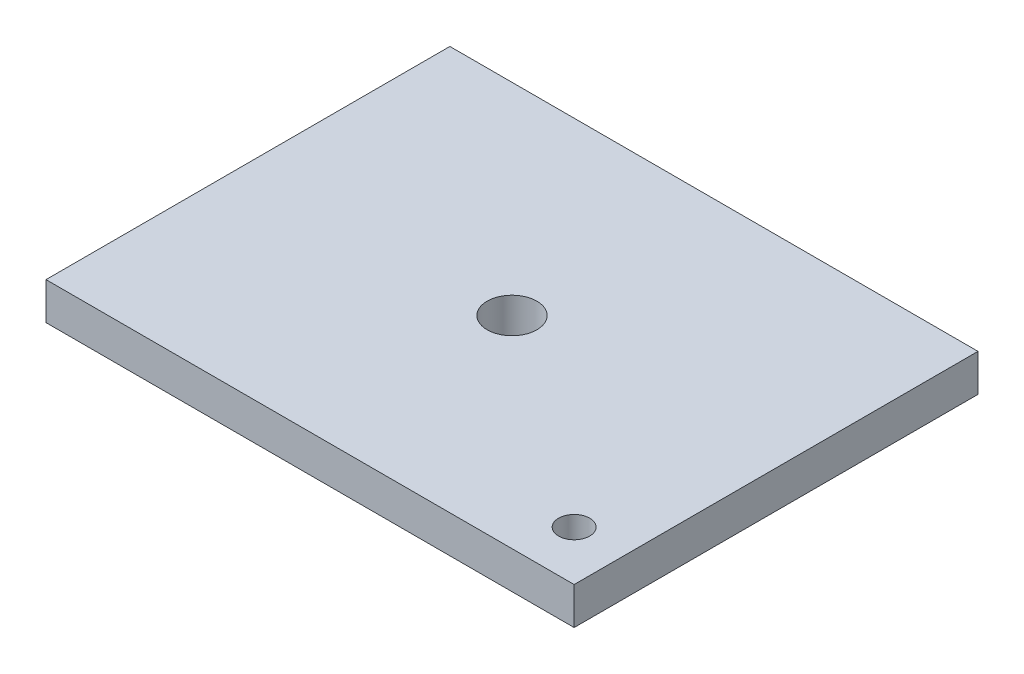
ISO-10303-21;
HEADER;
FILE_DESCRIPTION(('STEP AP214'),'2;1');
FILE_NAME('part.step','',(''),(''),'','','');
FILE_SCHEMA(('AUTOMOTIVE_DESIGN { 1 0 10303 214 1 1 1 1 }'));
ENDSEC;
DATA;
#1=APPLICATION_CONTEXT('core data for automotive mechanical design processes');
#2=APPLICATION_PROTOCOL_DEFINITION('international standard','automotive_design',2000,#1);
#3=PRODUCT_CONTEXT('',#1,'mechanical');
#4=PRODUCT('Part','Part','',(#3));
#5=PRODUCT_RELATED_PRODUCT_CATEGORY('part','',(#4));
#6=PRODUCT_DEFINITION_FORMATION('','',#4);
#7=PRODUCT_DEFINITION_CONTEXT('part definition',#1,'design');
#8=PRODUCT_DEFINITION('design','',#6,#7);
#9=PRODUCT_DEFINITION_SHAPE('','',#8);
#10=(LENGTH_UNIT() NAMED_UNIT(*) SI_UNIT(.MILLI.,.METRE.));
#11=(NAMED_UNIT(*) PLANE_ANGLE_UNIT() SI_UNIT($,.RADIAN.));
#12=(NAMED_UNIT(*) SI_UNIT($,.STERADIAN.) SOLID_ANGLE_UNIT());
#13=UNCERTAINTY_MEASURE_WITH_UNIT(LENGTH_MEASURE(1.E-05),#10,'distance_accuracy_value','');
#14=(GEOMETRIC_REPRESENTATION_CONTEXT(3) GLOBAL_UNCERTAINTY_ASSIGNED_CONTEXT((#13)) GLOBAL_UNIT_ASSIGNED_CONTEXT((#10,
#11,#12)) REPRESENTATION_CONTEXT('',''));
#15=CARTESIAN_POINT('',(0.,0.,0.));
#16=DIRECTION('',(0.,0.,1.));
#17=DIRECTION('',(1.,0.,0.));
#18=AXIS2_PLACEMENT_3D('',#15,#16,#17);
#19=CARTESIAN_POINT('',(0.,6.,65.));
#20=DIRECTION('',(0.,1.,0.));
#21=DIRECTION('',(0.,0.,1.));
#22=AXIS2_PLACEMENT_3D('',#19,#20,#21);
#23=PLANE('',#22);
#24=CARTESIAN_POINT('',(77.,6.,57.));
#25=DIRECTION('',(0.,1.,0.));
#26=DIRECTION('',(0.,0.,1.));
#27=AXIS2_PLACEMENT_3D('',#24,#25,#26);
#28=CIRCLE('',#27,2.5);
#29=CARTESIAN_POINT('',(77.,6.,59.5));
#30=VERTEX_POINT('',#29);
#31=EDGE_CURVE('E117',#30,#30,#28,.T.);
#32=ORIENTED_EDGE('',*,*,#31,.F.);
#33=EDGE_LOOP('',(#32));
#34=FACE_BOUND('',#33,.T.);
#35=DIRECTION('',(0.,0.,1.));
#36=VECTOR('',#35,1.);
#37=CARTESIAN_POINT('',(0.,6.,0.));
#38=LINE('',#37,#36);
#39=CARTESIAN_POINT('',(0.,6.,0.));
#40=VERTEX_POINT('',#39);
#41=CARTESIAN_POINT('',(0.,6.,65.));
#42=VERTEX_POINT('',#41);
#43=EDGE_CURVE('E84',#40,#42,#38,.T.);
#44=ORIENTED_EDGE('',*,*,#43,.T.);
#45=DIRECTION('',(1.,0.,0.));
#46=VECTOR('',#45,1.);
#47=CARTESIAN_POINT('',(0.,6.,65.));
#48=LINE('',#47,#46);
#49=CARTESIAN_POINT('',(85.,6.,65.));
#50=VERTEX_POINT('',#49);
#51=EDGE_CURVE('E79',#42,#50,#48,.T.);
#52=ORIENTED_EDGE('',*,*,#51,.T.);
#53=DIRECTION('',(0.,0.,-1.));
#54=VECTOR('',#53,1.);
#55=CARTESIAN_POINT('',(85.,6.,0.));
#56=LINE('',#55,#54);
#57=CARTESIAN_POINT('',(85.,6.,0.));
#58=VERTEX_POINT('',#57);
#59=EDGE_CURVE('E82',#50,#58,#56,.T.);
#60=ORIENTED_EDGE('',*,*,#59,.T.);
#61=DIRECTION('',(-1.,0.,0.));
#62=VECTOR('',#61,1.);
#63=CARTESIAN_POINT('',(0.,6.,0.));
#64=LINE('',#63,#62);
#65=EDGE_CURVE('E49',#58,#40,#64,.T.);
#66=ORIENTED_EDGE('',*,*,#65,.T.);
#67=EDGE_LOOP('',(#44,#52,#60,#66));
#68=FACE_BOUND('',#67,.T.);
#69=CARTESIAN_POINT('',(42.5,6.,32.5));
#70=DIRECTION('',(0.,1.,0.));
#71=DIRECTION('',(0.,0.,1.));
#72=AXIS2_PLACEMENT_3D('',#69,#70,#71);
#73=CIRCLE('',#72,4.00000000000001);
#74=CARTESIAN_POINT('',(42.5,6.,36.5));
#75=VERTEX_POINT('',#74);
#76=EDGE_CURVE('E99',#75,#75,#73,.T.);
#77=ORIENTED_EDGE('',*,*,#76,.F.);
#78=EDGE_LOOP('',(#77));
#79=FACE_BOUND('',#78,.T.);
#80=ADVANCED_FACE('F32',(#34,#68,#79),#23,.T.);
#81=CARTESIAN_POINT('',(0.,0.,65.));
#82=DIRECTION('',(0.,1.,0.));
#83=DIRECTION('',(0.,0.,1.));
#84=AXIS2_PLACEMENT_3D('',#81,#82,#83);
#85=PLANE('',#84);
#86=CARTESIAN_POINT('',(77.,0.,57.));
#87=DIRECTION('',(0.,1.,0.));
#88=DIRECTION('',(0.,0.,1.));
#89=AXIS2_PLACEMENT_3D('',#86,#87,#88);
#90=CIRCLE('',#89,2.5);
#91=CARTESIAN_POINT('',(77.,0.,59.5));
#92=VERTEX_POINT('',#91);
#93=EDGE_CURVE('E114',#92,#92,#90,.T.);
#94=ORIENTED_EDGE('',*,*,#93,.T.);
#95=EDGE_LOOP('',(#94));
#96=FACE_BOUND('',#95,.T.);
#97=DIRECTION('',(0.,0.,1.));
#98=VECTOR('',#97,1.);
#99=CARTESIAN_POINT('',(0.,0.,0.));
#100=LINE('',#99,#98);
#101=CARTESIAN_POINT('',(0.,0.,0.));
#102=VERTEX_POINT('',#101);
#103=CARTESIAN_POINT('',(0.,0.,65.));
#104=VERTEX_POINT('',#103);
#105=EDGE_CURVE('E96',#102,#104,#100,.T.);
#106=ORIENTED_EDGE('',*,*,#105,.F.);
#107=DIRECTION('',(-1.,0.,0.));
#108=VECTOR('',#107,1.);
#109=CARTESIAN_POINT('',(0.,0.,0.));
#110=LINE('',#109,#108);
#111=CARTESIAN_POINT('',(85.,0.,0.));
#112=VERTEX_POINT('',#111);
#113=EDGE_CURVE('E72',#112,#102,#110,.T.);
#114=ORIENTED_EDGE('',*,*,#113,.F.);
#115=DIRECTION('',(0.,0.,-1.));
#116=VECTOR('',#115,1.);
#117=CARTESIAN_POINT('',(85.,0.,0.));
#118=LINE('',#117,#116);
#119=CARTESIAN_POINT('',(85.,0.,65.));
#120=VERTEX_POINT('',#119);
#121=EDGE_CURVE('E66',#120,#112,#118,.T.);
#122=ORIENTED_EDGE('',*,*,#121,.F.);
#123=DIRECTION('',(1.,0.,0.));
#124=VECTOR('',#123,1.);
#125=CARTESIAN_POINT('',(0.,0.,65.));
#126=LINE('',#125,#124);
#127=EDGE_CURVE('E88',#104,#120,#126,.T.);
#128=ORIENTED_EDGE('',*,*,#127,.F.);
#129=EDGE_LOOP('',(#106,#114,#122,#128));
#130=FACE_BOUND('',#129,.T.);
#131=CARTESIAN_POINT('',(42.5,0.,32.5));
#132=DIRECTION('',(0.,1.,0.));
#133=DIRECTION('',(0.,0.,1.));
#134=AXIS2_PLACEMENT_3D('',#131,#132,#133);
#135=CIRCLE('',#134,4.00000000000001);
#136=CARTESIAN_POINT('',(42.5,0.,36.5));
#137=VERTEX_POINT('',#136);
#138=EDGE_CURVE('E111',#137,#137,#135,.T.);
#139=ORIENTED_EDGE('',*,*,#138,.T.);
#140=EDGE_LOOP('',(#139));
#141=FACE_BOUND('',#140,.T.);
#142=ADVANCED_FACE('F107',(#96,#130,#141),#85,.F.);
#143=CARTESIAN_POINT('',(0.,6.,0.));
#144=DIRECTION('',(1.,0.,0.));
#145=DIRECTION('',(0.,0.,-1.));
#146=AXIS2_PLACEMENT_3D('',#143,#144,#145);
#147=PLANE('',#146);
#148=ORIENTED_EDGE('',*,*,#105,.T.);
#149=DIRECTION('',(0.,-1.,0.));
#150=VECTOR('',#149,1.);
#151=CARTESIAN_POINT('',(0.,6.,65.));
#152=LINE('',#151,#150);
#153=EDGE_CURVE('E11',#42,#104,#152,.T.);
#154=ORIENTED_EDGE('',*,*,#153,.F.);
#155=ORIENTED_EDGE('',*,*,#43,.F.);
#156=DIRECTION('',(0.,-1.,0.));
#157=VECTOR('',#156,1.);
#158=CARTESIAN_POINT('',(0.,6.,0.));
#159=LINE('',#158,#157);
#160=EDGE_CURVE('E92',#40,#102,#159,.T.);
#161=ORIENTED_EDGE('',*,*,#160,.T.);
#162=EDGE_LOOP('',(#148,#154,#155,#161));
#163=FACE_BOUND('',#162,.T.);
#164=ADVANCED_FACE('F34',(#163),#147,.F.);
#165=CARTESIAN_POINT('',(0.,6.,65.));
#166=DIRECTION('',(0.,0.,-1.));
#167=DIRECTION('',(-1.,0.,0.));
#168=AXIS2_PLACEMENT_3D('',#165,#166,#167);
#169=PLANE('',#168);
#170=ORIENTED_EDGE('',*,*,#127,.T.);
#171=DIRECTION('',(0.,-1.,0.));
#172=VECTOR('',#171,1.);
#173=CARTESIAN_POINT('',(85.,6.,65.));
#174=LINE('',#173,#172);
#175=EDGE_CURVE('E41',#50,#120,#174,.T.);
#176=ORIENTED_EDGE('',*,*,#175,.F.);
#177=ORIENTED_EDGE('',*,*,#51,.F.);
#178=ORIENTED_EDGE('',*,*,#153,.T.);
#179=EDGE_LOOP('',(#170,#176,#177,#178));
#180=FACE_BOUND('',#179,.T.);
#181=ADVANCED_FACE('F87',(#180),#169,.F.);
#182=CARTESIAN_POINT('',(85.,6.,0.));
#183=DIRECTION('',(-1.,0.,0.));
#184=DIRECTION('',(0.,0.,1.));
#185=AXIS2_PLACEMENT_3D('',#182,#183,#184);
#186=PLANE('',#185);
#187=ORIENTED_EDGE('',*,*,#121,.T.);
#188=DIRECTION('',(0.,-1.,0.));
#189=VECTOR('',#188,1.);
#190=CARTESIAN_POINT('',(85.,6.,0.));
#191=LINE('',#190,#189);
#192=EDGE_CURVE('E89',#58,#112,#191,.T.);
#193=ORIENTED_EDGE('',*,*,#192,.F.);
#194=ORIENTED_EDGE('',*,*,#59,.F.);
#195=ORIENTED_EDGE('',*,*,#175,.T.);
#196=EDGE_LOOP('',(#187,#193,#194,#195));
#197=FACE_BOUND('',#196,.T.);
#198=ADVANCED_FACE('F90',(#197),#186,.F.);
#199=CARTESIAN_POINT('',(0.,6.,0.));
#200=DIRECTION('',(0.,0.,1.));
#201=DIRECTION('',(1.,0.,0.));
#202=AXIS2_PLACEMENT_3D('',#199,#200,#201);
#203=PLANE('',#202);
#204=ORIENTED_EDGE('',*,*,#113,.T.);
#205=ORIENTED_EDGE('',*,*,#160,.F.);
#206=ORIENTED_EDGE('',*,*,#65,.F.);
#207=ORIENTED_EDGE('',*,*,#192,.T.);
#208=EDGE_LOOP('',(#204,#205,#206,#207));
#209=FACE_BOUND('',#208,.T.);
#210=ADVANCED_FACE('F104',(#209),#203,.F.);
#211=CARTESIAN_POINT('',(42.5,6.,32.5));
#212=DIRECTION('',(0.,-1.,0.));
#213=DIRECTION('',(0.,0.,-1.));
#214=AXIS2_PLACEMENT_3D('',#211,#212,#213);
#215=CYLINDRICAL_SURFACE('',#214,4.00000000000001);
#216=ORIENTED_EDGE('',*,*,#76,.T.);
#217=EDGE_LOOP('',(#216));
#218=FACE_BOUND('',#217,.T.);
#219=ORIENTED_EDGE('',*,*,#138,.F.);
#220=EDGE_LOOP('',(#219));
#221=FACE_BOUND('',#220,.T.);
#222=ADVANCED_FACE('F127',(#218,#221),#215,.F.);
#223=CARTESIAN_POINT('',(77.,0.,57.));
#224=DIRECTION('',(0.,1.,0.));
#225=DIRECTION('',(0.,0.,1.));
#226=AXIS2_PLACEMENT_3D('',#223,#224,#225);
#227=CYLINDRICAL_SURFACE('',#226,2.5);
#228=ORIENTED_EDGE('',*,*,#93,.F.);
#229=EDGE_LOOP('',(#228));
#230=FACE_BOUND('',#229,.T.);
#231=ORIENTED_EDGE('',*,*,#31,.T.);
#232=EDGE_LOOP('',(#231));
#233=FACE_BOUND('',#232,.T.);
#234=ADVANCED_FACE('F124',(#230,#233),#227,.F.);
#235=CLOSED_SHELL('',(#80,#142,#164,#181,#198,#210,#222,#234));
#236=MANIFOLD_SOLID_BREP('B2',#235);
#237=ADVANCED_BREP_SHAPE_REPRESENTATION('',(#18,#236),#14);
#238=SHAPE_DEFINITION_REPRESENTATION(#9,#237);
ENDSEC;
END-ISO-10303-21;
